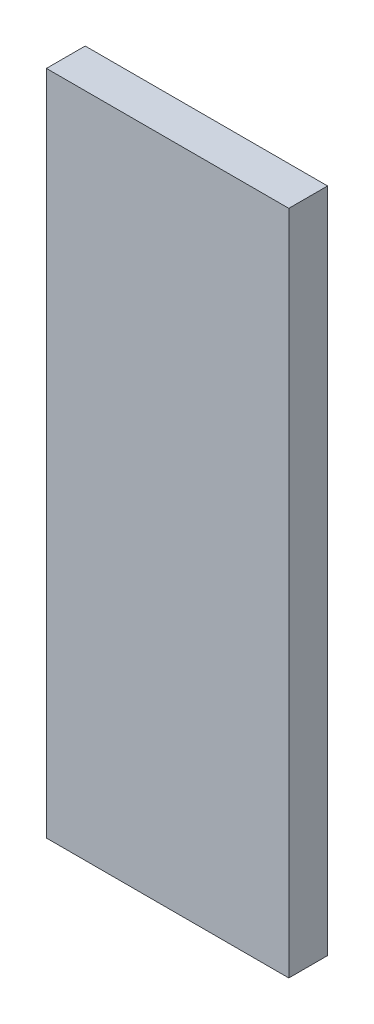
ISO-10303-21;
HEADER;
FILE_DESCRIPTION(('STEP AP214'),'2;1');
FILE_NAME('part.step','',(''),(''),'','','');
FILE_SCHEMA(('AUTOMOTIVE_DESIGN { 1 0 10303 214 1 1 1 1 }'));
ENDSEC;
DATA;
#1=APPLICATION_CONTEXT('core data for automotive mechanical design processes');
#2=APPLICATION_PROTOCOL_DEFINITION('international standard','automotive_design',2000,#1);
#3=PRODUCT_CONTEXT('',#1,'mechanical');
#4=PRODUCT('Part','Part','',(#3));
#5=PRODUCT_RELATED_PRODUCT_CATEGORY('part','',(#4));
#6=PRODUCT_DEFINITION_FORMATION('','',#4);
#7=PRODUCT_DEFINITION_CONTEXT('part definition',#1,'design');
#8=PRODUCT_DEFINITION('design','',#6,#7);
#9=PRODUCT_DEFINITION_SHAPE('','',#8);
#10=(LENGTH_UNIT() NAMED_UNIT(*) SI_UNIT(.MILLI.,.METRE.));
#11=(NAMED_UNIT(*) PLANE_ANGLE_UNIT() SI_UNIT($,.RADIAN.));
#12=(NAMED_UNIT(*) SI_UNIT($,.STERADIAN.) SOLID_ANGLE_UNIT());
#13=UNCERTAINTY_MEASURE_WITH_UNIT(LENGTH_MEASURE(1.E-05),#10,'distance_accuracy_value','');
#14=(GEOMETRIC_REPRESENTATION_CONTEXT(3) GLOBAL_UNCERTAINTY_ASSIGNED_CONTEXT((#13)) GLOBAL_UNIT_ASSIGNED_CONTEXT((#10,
#11,#12)) REPRESENTATION_CONTEXT('',''));
#15=CARTESIAN_POINT('',(0.,0.,0.));
#16=DIRECTION('',(0.,0.,1.));
#17=DIRECTION('',(1.,0.,0.));
#18=AXIS2_PLACEMENT_3D('',#15,#16,#17);
#19=CARTESIAN_POINT('',(-250.,0.,-80.));
#20=DIRECTION('',(-1.,0.,0.));
#21=DIRECTION('',(0.,0.,1.));
#22=AXIS2_PLACEMENT_3D('',#19,#20,#21);
#23=PLANE('',#22);
#24=DIRECTION('',(0.,-1.,0.));
#25=VECTOR('',#24,1.);
#26=CARTESIAN_POINT('',(-250.,0.,0.));
#27=LINE('',#26,#25);
#28=CARTESIAN_POINT('',(-250.,1375.,0.));
#29=VERTEX_POINT('',#28);
#30=CARTESIAN_POINT('',(-250.,0.,0.));
#31=VERTEX_POINT('',#30);
#32=EDGE_CURVE('E101',#29,#31,#27,.T.);
#33=ORIENTED_EDGE('',*,*,#32,.F.);
#34=DIRECTION('',(0.,0.,1.));
#35=VECTOR('',#34,1.);
#36=CARTESIAN_POINT('',(-250.,1375.,-80.));
#37=LINE('',#36,#35);
#38=CARTESIAN_POINT('',(-250.,1375.,-80.));
#39=VERTEX_POINT('',#38);
#40=EDGE_CURVE('E11',#39,#29,#37,.T.);
#41=ORIENTED_EDGE('',*,*,#40,.F.);
#42=DIRECTION('',(0.,-1.,0.));
#43=VECTOR('',#42,1.);
#44=CARTESIAN_POINT('',(-250.,0.,-80.));
#45=LINE('',#44,#43);
#46=CARTESIAN_POINT('',(-250.,0.,-80.));
#47=VERTEX_POINT('',#46);
#48=EDGE_CURVE('E95',#39,#47,#45,.T.);
#49=ORIENTED_EDGE('',*,*,#48,.T.);
#50=DIRECTION('',(0.,0.,1.));
#51=VECTOR('',#50,1.);
#52=CARTESIAN_POINT('',(-250.,0.,-80.));
#53=LINE('',#52,#51);
#54=EDGE_CURVE('E40',#47,#31,#53,.T.);
#55=ORIENTED_EDGE('',*,*,#54,.T.);
#56=EDGE_LOOP('',(#33,#41,#49,#55));
#57=FACE_BOUND('',#56,.T.);
#58=ADVANCED_FACE('F37',(#57),#23,.T.);
#59=CARTESIAN_POINT('',(-250.,1375.,-80.));
#60=DIRECTION('',(0.,1.,0.));
#61=DIRECTION('',(0.,0.,1.));
#62=AXIS2_PLACEMENT_3D('',#59,#60,#61);
#63=PLANE('',#62);
#64=DIRECTION('',(-1.,0.,0.));
#65=VECTOR('',#64,1.);
#66=CARTESIAN_POINT('',(-250.,1375.,0.));
#67=LINE('',#66,#65);
#68=CARTESIAN_POINT('',(250.,1375.,0.));
#69=VERTEX_POINT('',#68);
#70=EDGE_CURVE('E97',#69,#29,#67,.T.);
#71=ORIENTED_EDGE('',*,*,#70,.F.);
#72=DIRECTION('',(0.,0.,1.));
#73=VECTOR('',#72,1.);
#74=CARTESIAN_POINT('',(250.,1375.,-80.));
#75=LINE('',#74,#73);
#76=CARTESIAN_POINT('',(250.,1375.,-80.));
#77=VERTEX_POINT('',#76);
#78=EDGE_CURVE('E46',#77,#69,#75,.T.);
#79=ORIENTED_EDGE('',*,*,#78,.F.);
#80=DIRECTION('',(-1.,0.,0.));
#81=VECTOR('',#80,1.);
#82=CARTESIAN_POINT('',(-250.,1375.,-80.));
#83=LINE('',#82,#81);
#84=EDGE_CURVE('E92',#77,#39,#83,.T.);
#85=ORIENTED_EDGE('',*,*,#84,.T.);
#86=ORIENTED_EDGE('',*,*,#40,.T.);
#87=EDGE_LOOP('',(#71,#79,#85,#86));
#88=FACE_BOUND('',#87,.T.);
#89=ADVANCED_FACE('F111',(#88),#63,.T.);
#90=CARTESIAN_POINT('',(250.,0.,-80.));
#91=DIRECTION('',(1.,0.,0.));
#92=DIRECTION('',(0.,0.,-1.));
#93=AXIS2_PLACEMENT_3D('',#90,#91,#92);
#94=PLANE('',#93);
#95=DIRECTION('',(0.,1.,0.));
#96=VECTOR('',#95,1.);
#97=CARTESIAN_POINT('',(250.,0.,0.));
#98=LINE('',#97,#96);
#99=CARTESIAN_POINT('',(250.,0.,0.));
#100=VERTEX_POINT('',#99);
#101=EDGE_CURVE('E87',#100,#69,#98,.T.);
#102=ORIENTED_EDGE('',*,*,#101,.F.);
#103=DIRECTION('',(0.,0.,1.));
#104=VECTOR('',#103,1.);
#105=CARTESIAN_POINT('',(250.,0.,-80.));
#106=LINE('',#105,#104);
#107=CARTESIAN_POINT('',(250.,0.,-80.));
#108=VERTEX_POINT('',#107);
#109=EDGE_CURVE('E82',#108,#100,#106,.T.);
#110=ORIENTED_EDGE('',*,*,#109,.F.);
#111=DIRECTION('',(0.,1.,0.));
#112=VECTOR('',#111,1.);
#113=CARTESIAN_POINT('',(250.,0.,-80.));
#114=LINE('',#113,#112);
#115=EDGE_CURVE('E85',#108,#77,#114,.T.);
#116=ORIENTED_EDGE('',*,*,#115,.T.);
#117=ORIENTED_EDGE('',*,*,#78,.T.);
#118=EDGE_LOOP('',(#102,#110,#116,#117));
#119=FACE_BOUND('',#118,.T.);
#120=ADVANCED_FACE('F84',(#119),#94,.T.);
#121=CARTESIAN_POINT('',(-250.,0.,-80.));
#122=DIRECTION('',(0.,-1.,0.));
#123=DIRECTION('',(0.,0.,-1.));
#124=AXIS2_PLACEMENT_3D('',#121,#122,#123);
#125=PLANE('',#124);
#126=DIRECTION('',(1.,0.,0.));
#127=VECTOR('',#126,1.);
#128=CARTESIAN_POINT('',(-250.,0.,0.));
#129=LINE('',#128,#127);
#130=EDGE_CURVE('E104',#31,#100,#129,.T.);
#131=ORIENTED_EDGE('',*,*,#130,.F.);
#132=ORIENTED_EDGE('',*,*,#54,.F.);
#133=DIRECTION('',(1.,0.,0.));
#134=VECTOR('',#133,1.);
#135=CARTESIAN_POINT('',(-250.,0.,-80.));
#136=LINE('',#135,#134);
#137=EDGE_CURVE('E91',#47,#108,#136,.T.);
#138=ORIENTED_EDGE('',*,*,#137,.T.);
#139=ORIENTED_EDGE('',*,*,#109,.T.);
#140=EDGE_LOOP('',(#131,#132,#138,#139));
#141=FACE_BOUND('',#140,.T.);
#142=ADVANCED_FACE('F94',(#141),#125,.T.);
#143=CARTESIAN_POINT('',(0.,0.,-80.));
#144=DIRECTION('',(0.,0.,-1.));
#145=DIRECTION('',(-1.,0.,0.));
#146=AXIS2_PLACEMENT_3D('',#143,#144,#145);
#147=PLANE('',#146);
#148=ORIENTED_EDGE('',*,*,#48,.F.);
#149=ORIENTED_EDGE('',*,*,#84,.F.);
#150=ORIENTED_EDGE('',*,*,#115,.F.);
#151=ORIENTED_EDGE('',*,*,#137,.F.);
#152=EDGE_LOOP('',(#148,#149,#150,#151));
#153=FACE_BOUND('',#152,.T.);
#154=ADVANCED_FACE('F90',(#153),#147,.T.);
#155=CARTESIAN_POINT('',(0.,0.,0.));
#156=DIRECTION('',(0.,0.,-1.));
#157=DIRECTION('',(-1.,0.,0.));
#158=AXIS2_PLACEMENT_3D('',#155,#156,#157);
#159=PLANE('',#158);
#160=ORIENTED_EDGE('',*,*,#32,.T.);
#161=ORIENTED_EDGE('',*,*,#130,.T.);
#162=ORIENTED_EDGE('',*,*,#101,.T.);
#163=ORIENTED_EDGE('',*,*,#70,.T.);
#164=EDGE_LOOP('',(#160,#161,#162,#163));
#165=FACE_BOUND('',#164,.T.);
#166=ADVANCED_FACE('F110',(#165),#159,.F.);
#167=CLOSED_SHELL('',(#58,#89,#120,#142,#154,#166));
#168=MANIFOLD_SOLID_BREP('B2',#167);
#169=ADVANCED_BREP_SHAPE_REPRESENTATION('',(#18,#168),#14);
#170=SHAPE_DEFINITION_REPRESENTATION(#9,#169);
ENDSEC;
END-ISO-10303-21;
